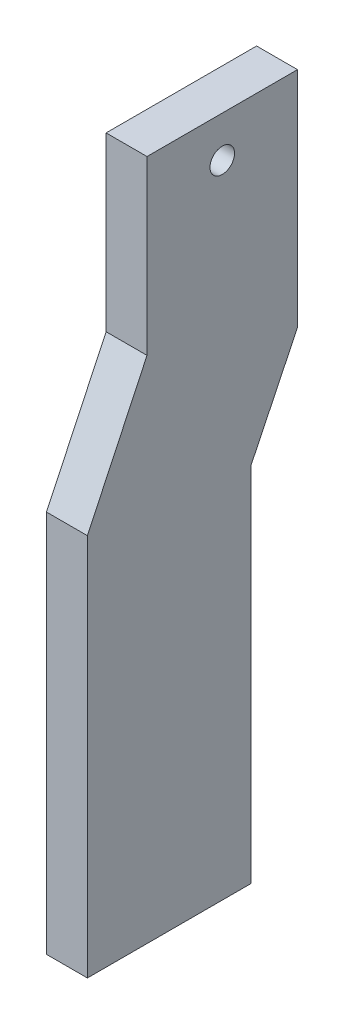
ISO-10303-21;
HEADER;
FILE_DESCRIPTION(('STEP AP214'),'2;1');
FILE_NAME('part.step','',(''),(''),'','','');
FILE_SCHEMA(('AUTOMOTIVE_DESIGN { 1 0 10303 214 1 1 1 1 }'));
ENDSEC;
DATA;
#1=APPLICATION_CONTEXT('core data for automotive mechanical design processes');
#2=APPLICATION_PROTOCOL_DEFINITION('international standard','automotive_design',2000,#1);
#3=PRODUCT_CONTEXT('',#1,'mechanical');
#4=PRODUCT('Part','Part','',(#3));
#5=PRODUCT_RELATED_PRODUCT_CATEGORY('part','',(#4));
#6=PRODUCT_DEFINITION_FORMATION('','',#4);
#7=PRODUCT_DEFINITION_CONTEXT('part definition',#1,'design');
#8=PRODUCT_DEFINITION('design','',#6,#7);
#9=PRODUCT_DEFINITION_SHAPE('','',#8);
#10=(LENGTH_UNIT() NAMED_UNIT(*) SI_UNIT(.MILLI.,.METRE.));
#11=(NAMED_UNIT(*) PLANE_ANGLE_UNIT() SI_UNIT($,.RADIAN.));
#12=(NAMED_UNIT(*) SI_UNIT($,.STERADIAN.) SOLID_ANGLE_UNIT());
#13=UNCERTAINTY_MEASURE_WITH_UNIT(LENGTH_MEASURE(1.E-05),#10,'distance_accuracy_value','');
#14=(GEOMETRIC_REPRESENTATION_CONTEXT(3) GLOBAL_UNCERTAINTY_ASSIGNED_CONTEXT((#13)) GLOBAL_UNIT_ASSIGNED_CONTEXT((#10,
#11,#12)) REPRESENTATION_CONTEXT('',''));
#15=CARTESIAN_POINT('',(0.,0.,0.));
#16=DIRECTION('',(0.,0.,1.));
#17=DIRECTION('',(1.,0.,0.));
#18=AXIS2_PLACEMENT_3D('',#15,#16,#17);
#19=CARTESIAN_POINT('',(10.,58.3956146638437,-20.0000999096368));
#20=DIRECTION('',(0.,0.,1.));
#21=DIRECTION('',(0.,-1.,0.));
#22=AXIS2_PLACEMENT_3D('',#19,#20,#21);
#23=PLANE('',#22);
#24=DIRECTION('',(0.,1.,0.));
#25=VECTOR('',#24,1.);
#26=CARTESIAN_POINT('',(0.,58.3956146638437,-20.0000999096368));
#27=LINE('',#26,#25);
#28=CARTESIAN_POINT('',(0.,-30.1438635348826,-20.0000999096368));
#29=VERTEX_POINT('',#28);
#30=CARTESIAN_POINT('',(0.,58.3956146638437,-20.0000999096368));
#31=VERTEX_POINT('',#30);
#32=EDGE_CURVE('E129',#29,#31,#27,.T.);
#33=ORIENTED_EDGE('',*,*,#32,.T.);
#34=DIRECTION('',(-1.,0.,0.));
#35=VECTOR('',#34,1.);
#36=CARTESIAN_POINT('',(10.,58.3956146638437,-20.0000999096368));
#37=LINE('',#36,#35);
#38=CARTESIAN_POINT('',(10.,58.3956146638437,-20.0000999096368));
#39=VERTEX_POINT('',#38);
#40=EDGE_CURVE('E11',#39,#31,#37,.T.);
#41=ORIENTED_EDGE('',*,*,#40,.F.);
#42=DIRECTION('',(0.,1.,0.));
#43=VECTOR('',#42,1.);
#44=CARTESIAN_POINT('',(10.,58.3956146638437,-20.0000999096368));
#45=LINE('',#44,#43);
#46=CARTESIAN_POINT('',(10.,-30.1438635348826,-20.0000999096368));
#47=VERTEX_POINT('',#46);
#48=EDGE_CURVE('E144',#47,#39,#45,.T.);
#49=ORIENTED_EDGE('',*,*,#48,.F.);
#50=DIRECTION('',(-1.,0.,0.));
#51=VECTOR('',#50,1.);
#52=CARTESIAN_POINT('',(10.,-30.1438635348826,-20.0000999096368));
#53=LINE('',#52,#51);
#54=EDGE_CURVE('E125',#47,#29,#53,.T.);
#55=ORIENTED_EDGE('',*,*,#54,.T.);
#56=EDGE_LOOP('',(#33,#41,#49,#55));
#57=FACE_BOUND('',#56,.T.);
#58=ADVANCED_FACE('F33',(#57),#23,.F.);
#59=CARTESIAN_POINT('',(10.,58.3956146638437,-20.0000999096368));
#60=DIRECTION('',(0.,0.435006692942544,0.900427219210521));
#61=DIRECTION('',(0.,-0.900427219210521,0.435006692942544));
#62=AXIS2_PLACEMENT_3D('',#59,#60,#61);
#63=PLANE('',#62);
#64=DIRECTION('',(0.,0.900427219210521,-0.435006692942544));
#65=VECTOR('',#64,1.);
#66=CARTESIAN_POINT('',(0.,58.3956146638437,-20.0000999096368));
#67=LINE('',#66,#65);
#68=CARTESIAN_POINT('',(0.,81.8971266756969,-31.3539492839254));
#69=VERTEX_POINT('',#68);
#70=EDGE_CURVE('E132',#31,#69,#67,.T.);
#71=ORIENTED_EDGE('',*,*,#70,.T.);
#72=DIRECTION('',(-1.,0.,0.));
#73=VECTOR('',#72,1.);
#74=CARTESIAN_POINT('',(10.,81.8971266756969,-31.3539492839254));
#75=LINE('',#74,#73);
#76=CARTESIAN_POINT('',(10.,81.8971266756969,-31.3539492839254));
#77=VERTEX_POINT('',#76);
#78=EDGE_CURVE('E41',#77,#69,#75,.T.);
#79=ORIENTED_EDGE('',*,*,#78,.F.);
#80=DIRECTION('',(0.,0.900427219210521,-0.435006692942544));
#81=VECTOR('',#80,1.);
#82=CARTESIAN_POINT('',(10.,58.3956146638437,-20.0000999096368));
#83=LINE('',#82,#81);
#84=EDGE_CURVE('E92',#39,#77,#83,.T.);
#85=ORIENTED_EDGE('',*,*,#84,.F.);
#86=ORIENTED_EDGE('',*,*,#40,.T.);
#87=EDGE_LOOP('',(#71,#79,#85,#86));
#88=FACE_BOUND('',#87,.T.);
#89=ADVANCED_FACE('F198',(#88),#63,.F.);
#90=CARTESIAN_POINT('',(10.,136.453197443825,-31.3539492839253));
#91=DIRECTION('',(0.,0.,1.));
#92=DIRECTION('',(0.,-1.,0.));
#93=AXIS2_PLACEMENT_3D('',#90,#91,#92);
#94=PLANE('',#93);
#95=DIRECTION('',(0.,1.,0.));
#96=VECTOR('',#95,1.);
#97=CARTESIAN_POINT('',(0.,136.453197443825,-31.3539492839253));
#98=LINE('',#97,#96);
#99=CARTESIAN_POINT('',(0.,136.453197443825,-31.3539492839253));
#100=VERTEX_POINT('',#99);
#101=EDGE_CURVE('E135',#69,#100,#98,.T.);
#102=ORIENTED_EDGE('',*,*,#101,.T.);
#103=DIRECTION('',(-1.,0.,0.));
#104=VECTOR('',#103,1.);
#105=CARTESIAN_POINT('',(10.,136.453197443825,-31.3539492839253));
#106=LINE('',#105,#104);
#107=CARTESIAN_POINT('',(10.,136.453197443825,-31.3539492839253));
#108=VERTEX_POINT('',#107);
#109=EDGE_CURVE('E151',#108,#100,#106,.T.);
#110=ORIENTED_EDGE('',*,*,#109,.F.);
#111=DIRECTION('',(0.,1.,0.));
#112=VECTOR('',#111,1.);
#113=CARTESIAN_POINT('',(10.,136.453197443825,-31.3539492839253));
#114=LINE('',#113,#112);
#115=EDGE_CURVE('E159',#77,#108,#114,.T.);
#116=ORIENTED_EDGE('',*,*,#115,.F.);
#117=ORIENTED_EDGE('',*,*,#78,.T.);
#118=EDGE_LOOP('',(#102,#110,#116,#117));
#119=FACE_BOUND('',#118,.T.);
#120=ADVANCED_FACE('F157',(#119),#94,.F.);
#121=CARTESIAN_POINT('',(10.,136.453197443825,5.43069652360427));
#122=DIRECTION('',(0.,-1.,0.));
#123=DIRECTION('',(0.,0.,-1.));
#124=AXIS2_PLACEMENT_3D('',#121,#122,#123);
#125=PLANE('',#124);
#126=DIRECTION('',(0.,0.,1.));
#127=VECTOR('',#126,1.);
#128=CARTESIAN_POINT('',(0.,136.453197443825,5.43069652360427));
#129=LINE('',#128,#127);
#130=CARTESIAN_POINT('',(0.,136.453197443825,5.43069652360427));
#131=VERTEX_POINT('',#130);
#132=EDGE_CURVE('E137',#100,#131,#129,.T.);
#133=ORIENTED_EDGE('',*,*,#132,.T.);
#134=DIRECTION('',(-1.,0.,0.));
#135=VECTOR('',#134,1.);
#136=CARTESIAN_POINT('',(10.,136.453197443825,5.43069652360427));
#137=LINE('',#136,#135);
#138=CARTESIAN_POINT('',(10.,136.453197443825,5.43069652360427));
#139=VERTEX_POINT('',#138);
#140=EDGE_CURVE('E148',#139,#131,#137,.T.);
#141=ORIENTED_EDGE('',*,*,#140,.F.);
#142=DIRECTION('',(0.,0.,1.));
#143=VECTOR('',#142,1.);
#144=CARTESIAN_POINT('',(10.,136.453197443825,5.43069652360427));
#145=LINE('',#144,#143);
#146=EDGE_CURVE('E171',#108,#139,#145,.T.);
#147=ORIENTED_EDGE('',*,*,#146,.F.);
#148=ORIENTED_EDGE('',*,*,#109,.T.);
#149=EDGE_LOOP('',(#133,#141,#147,#148));
#150=FACE_BOUND('',#149,.T.);
#151=ADVANCED_FACE('F167',(#150),#125,.F.);
#152=CARTESIAN_POINT('',(10.,94.3588410134998,5.43069652360427));
#153=DIRECTION('',(0.,0.,-1.));
#154=DIRECTION('',(-1.,0.,0.));
#155=AXIS2_PLACEMENT_3D('',#152,#153,#154);
#156=PLANE('',#155);
#157=DIRECTION('',(0.,-1.,0.));
#158=VECTOR('',#157,1.);
#159=CARTESIAN_POINT('',(0.,94.3588410134998,5.43069652360427));
#160=LINE('',#159,#158);
#161=CARTESIAN_POINT('',(0.,94.3588410134998,5.43069652360427));
#162=VERTEX_POINT('',#161);
#163=EDGE_CURVE('E139',#131,#162,#160,.T.);
#164=ORIENTED_EDGE('',*,*,#163,.T.);
#165=DIRECTION('',(-1.,0.,0.));
#166=VECTOR('',#165,1.);
#167=CARTESIAN_POINT('',(10.,94.3588410134998,5.43069652360427));
#168=LINE('',#167,#166);
#169=CARTESIAN_POINT('',(10.,94.3588410134998,5.43069652360427));
#170=VERTEX_POINT('',#169);
#171=EDGE_CURVE('E120',#170,#162,#168,.T.);
#172=ORIENTED_EDGE('',*,*,#171,.F.);
#173=DIRECTION('',(0.,-1.,0.));
#174=VECTOR('',#173,1.);
#175=CARTESIAN_POINT('',(10.,94.3588410134998,5.43069652360427));
#176=LINE('',#175,#174);
#177=EDGE_CURVE('E111',#139,#170,#176,.T.);
#178=ORIENTED_EDGE('',*,*,#177,.F.);
#179=ORIENTED_EDGE('',*,*,#140,.T.);
#180=EDGE_LOOP('',(#164,#172,#178,#179));
#181=FACE_BOUND('',#180,.T.);
#182=ADVANCED_FACE('F170',(#181),#156,.F.);
#183=CARTESIAN_POINT('',(10.,63.4836957867797,19.9999000903632));
#184=DIRECTION('',(0.,-0.426749393185844,-0.904369921777319));
#185=DIRECTION('',(0.,0.904369921777319,-0.426749393185844));
#186=AXIS2_PLACEMENT_3D('',#183,#184,#185);
#187=PLANE('',#186);
#188=DIRECTION('',(0.,-0.904369921777319,0.426749393185844));
#189=VECTOR('',#188,1.);
#190=CARTESIAN_POINT('',(0.,63.4836957867797,19.9999000903632));
#191=LINE('',#190,#189);
#192=CARTESIAN_POINT('',(0.,63.4836957867797,19.9999000903632));
#193=VERTEX_POINT('',#192);
#194=EDGE_CURVE('E119',#162,#193,#191,.T.);
#195=ORIENTED_EDGE('',*,*,#194,.T.);
#196=DIRECTION('',(-1.,0.,0.));
#197=VECTOR('',#196,1.);
#198=CARTESIAN_POINT('',(10.,63.4836957867797,19.9999000903632));
#199=LINE('',#198,#197);
#200=CARTESIAN_POINT('',(10.,63.4836957867797,19.9999000903632));
#201=VERTEX_POINT('',#200);
#202=EDGE_CURVE('E116',#201,#193,#199,.T.);
#203=ORIENTED_EDGE('',*,*,#202,.F.);
#204=DIRECTION('',(0.,-0.904369921777319,0.426749393185844));
#205=VECTOR('',#204,1.);
#206=CARTESIAN_POINT('',(10.,63.4836957867797,19.9999000903632));
#207=LINE('',#206,#205);
#208=EDGE_CURVE('E105',#170,#201,#207,.T.);
#209=ORIENTED_EDGE('',*,*,#208,.F.);
#210=ORIENTED_EDGE('',*,*,#171,.T.);
#211=EDGE_LOOP('',(#195,#203,#209,#210));
#212=FACE_BOUND('',#211,.T.);
#213=ADVANCED_FACE('F117',(#212),#187,.F.);
#214=CARTESIAN_POINT('',(10.,63.4836957867797,19.9999000903632));
#215=DIRECTION('',(0.,0.,-1.));
#216=DIRECTION('',(0.,1.,0.));
#217=AXIS2_PLACEMENT_3D('',#214,#215,#216);
#218=PLANE('',#217);
#219=DIRECTION('',(0.,-1.,0.));
#220=VECTOR('',#219,1.);
#221=CARTESIAN_POINT('',(0.,63.4836957867797,19.9999000903632));
#222=LINE('',#221,#220);
#223=CARTESIAN_POINT('',(0.,-30.1438635348826,19.9999000903632));
#224=VERTEX_POINT('',#223);
#225=EDGE_CURVE('E78',#193,#224,#222,.T.);
#226=ORIENTED_EDGE('',*,*,#225,.T.);
#227=DIRECTION('',(-1.,0.,0.));
#228=VECTOR('',#227,1.);
#229=CARTESIAN_POINT('',(10.,-30.1438635348826,19.9999000903632));
#230=LINE('',#229,#228);
#231=CARTESIAN_POINT('',(10.,-30.1438635348826,19.9999000903632));
#232=VERTEX_POINT('',#231);
#233=EDGE_CURVE('E121',#232,#224,#230,.T.);
#234=ORIENTED_EDGE('',*,*,#233,.F.);
#235=DIRECTION('',(0.,-1.,0.));
#236=VECTOR('',#235,1.);
#237=CARTESIAN_POINT('',(10.,63.4836957867797,19.9999000903632));
#238=LINE('',#237,#236);
#239=EDGE_CURVE('E109',#201,#232,#238,.T.);
#240=ORIENTED_EDGE('',*,*,#239,.F.);
#241=ORIENTED_EDGE('',*,*,#202,.T.);
#242=EDGE_LOOP('',(#226,#234,#240,#241));
#243=FACE_BOUND('',#242,.T.);
#244=ADVANCED_FACE('F123',(#243),#218,.F.);
#245=CARTESIAN_POINT('',(10.,-30.1438635348826,19.9999000903632));
#246=DIRECTION('',(0.,1.,0.));
#247=DIRECTION('',(0.,0.,1.));
#248=AXIS2_PLACEMENT_3D('',#245,#246,#247);
#249=PLANE('',#248);
#250=DIRECTION('',(0.,0.,-1.));
#251=VECTOR('',#250,1.);
#252=CARTESIAN_POINT('',(0.,-30.1438635348826,19.9999000903632));
#253=LINE('',#252,#251);
#254=EDGE_CURVE('E84',#224,#29,#253,.T.);
#255=ORIENTED_EDGE('',*,*,#254,.T.);
#256=ORIENTED_EDGE('',*,*,#54,.F.);
#257=DIRECTION('',(0.,0.,-1.));
#258=VECTOR('',#257,1.);
#259=CARTESIAN_POINT('',(10.,-30.1438635348826,19.9999000903632));
#260=LINE('',#259,#258);
#261=EDGE_CURVE('E49',#232,#47,#260,.T.);
#262=ORIENTED_EDGE('',*,*,#261,.F.);
#263=ORIENTED_EDGE('',*,*,#233,.T.);
#264=EDGE_LOOP('',(#255,#256,#262,#263));
#265=FACE_BOUND('',#264,.T.);
#266=ADVANCED_FACE('F193',(#265),#249,.F.);
#267=CARTESIAN_POINT('',(10.,-30.1438635348826,-20.0000999096368));
#268=DIRECTION('',(1.,0.,0.));
#269=DIRECTION('',(0.,0.,-1.));
#270=AXIS2_PLACEMENT_3D('',#267,#268,#269);
#271=PLANE('',#270);
#272=CARTESIAN_POINT('',(10.,126.453197443825,-12.9616263801605));
#273=DIRECTION('',(1.,0.,0.));
#274=DIRECTION('',(0.,0.,-1.));
#275=AXIS2_PLACEMENT_3D('',#272,#273,#274);
#276=CIRCLE('',#275,3.);
#277=CARTESIAN_POINT('',(10.,126.453197443825,-15.9616263801605));
#278=VERTEX_POINT('',#277);
#279=EDGE_CURVE('E133',#278,#278,#276,.T.);
#280=ORIENTED_EDGE('',*,*,#279,.F.);
#281=EDGE_LOOP('',(#280));
#282=FACE_BOUND('',#281,.T.);
#283=ORIENTED_EDGE('',*,*,#48,.T.);
#284=ORIENTED_EDGE('',*,*,#84,.T.);
#285=ORIENTED_EDGE('',*,*,#115,.T.);
#286=ORIENTED_EDGE('',*,*,#146,.T.);
#287=ORIENTED_EDGE('',*,*,#177,.T.);
#288=ORIENTED_EDGE('',*,*,#208,.T.);
#289=ORIENTED_EDGE('',*,*,#239,.T.);
#290=ORIENTED_EDGE('',*,*,#261,.T.);
#291=EDGE_LOOP('',(#283,#284,#285,#286,#287,#288,#289,#290));
#292=FACE_BOUND('',#291,.T.);
#293=ADVANCED_FACE('F107',(#282,#292),#271,.T.);
#294=CARTESIAN_POINT('',(0.,-30.1438635348826,-20.0000999096368));
#295=DIRECTION('',(1.,0.,0.));
#296=DIRECTION('',(0.,0.,-1.));
#297=AXIS2_PLACEMENT_3D('',#294,#295,#296);
#298=PLANE('',#297);
#299=CARTESIAN_POINT('',(0.,126.453197443825,-12.9616263801605));
#300=DIRECTION('',(-1.,0.,0.));
#301=DIRECTION('',(0.,0.,1.));
#302=AXIS2_PLACEMENT_3D('',#299,#300,#301);
#303=CIRCLE('',#302,3.);
#304=CARTESIAN_POINT('',(0.,126.453197443825,-9.96162638016054));
#305=VERTEX_POINT('',#304);
#306=EDGE_CURVE('E179',#305,#305,#303,.T.);
#307=ORIENTED_EDGE('',*,*,#306,.F.);
#308=EDGE_LOOP('',(#307));
#309=FACE_BOUND('',#308,.T.);
#310=ORIENTED_EDGE('',*,*,#32,.F.);
#311=ORIENTED_EDGE('',*,*,#254,.F.);
#312=ORIENTED_EDGE('',*,*,#225,.F.);
#313=ORIENTED_EDGE('',*,*,#194,.F.);
#314=ORIENTED_EDGE('',*,*,#163,.F.);
#315=ORIENTED_EDGE('',*,*,#132,.F.);
#316=ORIENTED_EDGE('',*,*,#101,.F.);
#317=ORIENTED_EDGE('',*,*,#70,.F.);
#318=EDGE_LOOP('',(#310,#311,#312,#313,#314,#315,#316,#317));
#319=FACE_BOUND('',#318,.T.);
#320=ADVANCED_FACE('F163',(#309,#319),#298,.F.);
#321=CARTESIAN_POINT('',(25.,126.453197443825,-12.9616263801605));
#322=DIRECTION('',(-1.,0.,0.));
#323=DIRECTION('',(0.,0.,1.));
#324=AXIS2_PLACEMENT_3D('',#321,#322,#323);
#325=CYLINDRICAL_SURFACE('',#324,3.);
#326=ORIENTED_EDGE('',*,*,#279,.T.);
#327=EDGE_LOOP('',(#326));
#328=FACE_BOUND('',#327,.T.);
#329=ORIENTED_EDGE('',*,*,#306,.T.);
#330=EDGE_LOOP('',(#329));
#331=FACE_BOUND('',#330,.T.);
#332=ADVANCED_FACE('F183',(#328,#331),#325,.F.);
#333=CLOSED_SHELL('',(#58,#89,#120,#151,#182,#213,#244,#266,#293,#320,#332));
#334=MANIFOLD_SOLID_BREP('B2',#333);
#335=ADVANCED_BREP_SHAPE_REPRESENTATION('',(#18,#334),#14);
#336=SHAPE_DEFINITION_REPRESENTATION(#9,#335);
ENDSEC;
END-ISO-10303-21;
